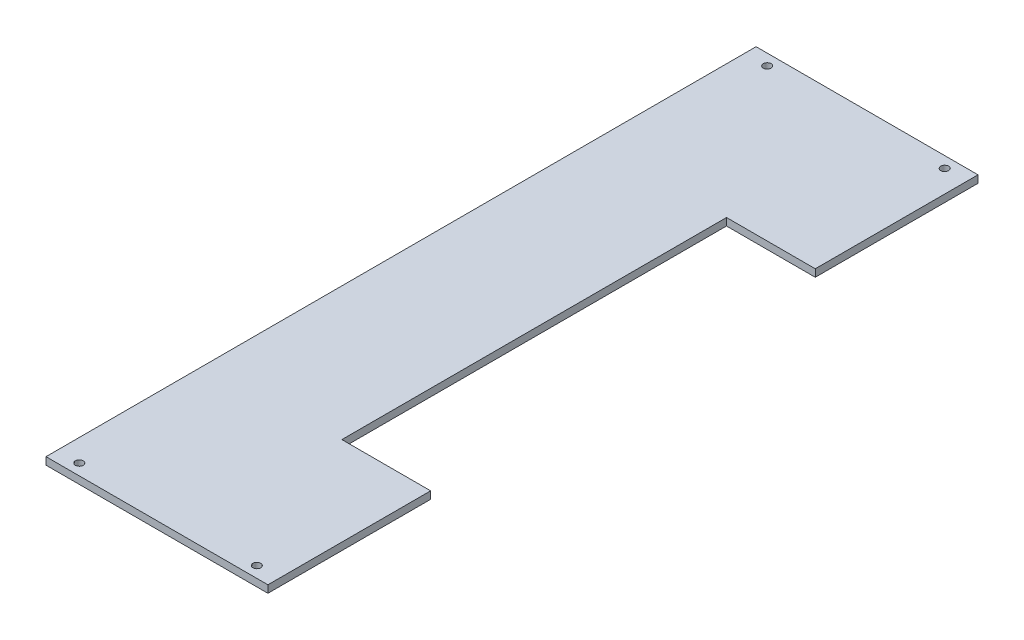
ISO-10303-21;
HEADER;
FILE_DESCRIPTION(('STEP AP214'),'2;1');
FILE_NAME('part.step','',(''),(''),'','','');
FILE_SCHEMA(('AUTOMOTIVE_DESIGN { 1 0 10303 214 1 1 1 1 }'));
ENDSEC;
DATA;
#1=APPLICATION_CONTEXT('core data for automotive mechanical design processes');
#2=APPLICATION_PROTOCOL_DEFINITION('international standard','automotive_design',2000,#1);
#3=PRODUCT_CONTEXT('',#1,'mechanical');
#4=PRODUCT('Part','Part','',(#3));
#5=PRODUCT_RELATED_PRODUCT_CATEGORY('part','',(#4));
#6=PRODUCT_DEFINITION_FORMATION('','',#4);
#7=PRODUCT_DEFINITION_CONTEXT('part definition',#1,'design');
#8=PRODUCT_DEFINITION('design','',#6,#7);
#9=PRODUCT_DEFINITION_SHAPE('','',#8);
#10=(LENGTH_UNIT() NAMED_UNIT(*) SI_UNIT(.MILLI.,.METRE.));
#11=(NAMED_UNIT(*) PLANE_ANGLE_UNIT() SI_UNIT($,.RADIAN.));
#12=(NAMED_UNIT(*) SI_UNIT($,.STERADIAN.) SOLID_ANGLE_UNIT());
#13=UNCERTAINTY_MEASURE_WITH_UNIT(LENGTH_MEASURE(1.E-05),#10,'distance_accuracy_value','');
#14=(GEOMETRIC_REPRESENTATION_CONTEXT(3) GLOBAL_UNCERTAINTY_ASSIGNED_CONTEXT((#13)) GLOBAL_UNIT_ASSIGNED_CONTEXT((#10,
#11,#12)) REPRESENTATION_CONTEXT('',''));
#15=CARTESIAN_POINT('',(0.,0.,0.));
#16=DIRECTION('',(0.,0.,1.));
#17=DIRECTION('',(1.,0.,0.));
#18=AXIS2_PLACEMENT_3D('',#15,#16,#17);
#19=CARTESIAN_POINT('',(0.,6.35,0.));
#20=DIRECTION('',(0.,1.,0.));
#21=DIRECTION('',(0.,0.,1.));
#22=AXIS2_PLACEMENT_3D('',#19,#20,#21);
#23=PLANE('',#22);
#24=CARTESIAN_POINT('',(76.2,6.35,-295.275));
#25=DIRECTION('',(0.,-1.,0.));
#26=DIRECTION('',(0.,0.,-1.));
#27=AXIS2_PLACEMENT_3D('',#24,#25,#26);
#28=CIRCLE('',#27,3.3655);
#29=CARTESIAN_POINT('',(76.2,6.35,-298.6405));
#30=VERTEX_POINT('',#29);
#31=EDGE_CURVE('E118',#30,#30,#28,.T.);
#32=ORIENTED_EDGE('',*,*,#31,.T.);
#33=EDGE_LOOP('',(#32));
#34=FACE_BOUND('',#33,.T.);
#35=CARTESIAN_POINT('',(-76.2,6.35,-295.275));
#36=DIRECTION('',(0.,-1.,0.));
#37=DIRECTION('',(0.,0.,-1.));
#38=AXIS2_PLACEMENT_3D('',#35,#36,#37);
#39=CIRCLE('',#38,3.3655);
#40=CARTESIAN_POINT('',(-76.2,6.35,-298.6405));
#41=VERTEX_POINT('',#40);
#42=EDGE_CURVE('E121',#41,#41,#39,.T.);
#43=ORIENTED_EDGE('',*,*,#42,.T.);
#44=EDGE_LOOP('',(#43));
#45=FACE_BOUND('',#44,.T.);
#46=CARTESIAN_POINT('',(76.2,6.35,295.275));
#47=DIRECTION('',(0.,1.,0.));
#48=DIRECTION('',(0.,0.,1.));
#49=AXIS2_PLACEMENT_3D('',#46,#47,#48);
#50=CIRCLE('',#49,3.3655);
#51=CARTESIAN_POINT('',(76.2,6.35,298.6405));
#52=VERTEX_POINT('',#51);
#53=EDGE_CURVE('E123',#52,#52,#50,.F.);
#54=ORIENTED_EDGE('',*,*,#53,.T.);
#55=EDGE_LOOP('',(#54));
#56=FACE_BOUND('',#55,.T.);
#57=CARTESIAN_POINT('',(-76.2,6.35,295.275));
#58=DIRECTION('',(0.,1.,0.));
#59=DIRECTION('',(0.,0.,1.));
#60=AXIS2_PLACEMENT_3D('',#57,#58,#59);
#61=CIRCLE('',#60,3.3655);
#62=CARTESIAN_POINT('',(-76.2,6.35,298.6405));
#63=VERTEX_POINT('',#62);
#64=EDGE_CURVE('E20',#63,#63,#61,.F.);
#65=ORIENTED_EDGE('',*,*,#64,.T.);
#66=EDGE_LOOP('',(#65));
#67=FACE_BOUND('',#66,.T.);
#68=DIRECTION('',(0.,0.,1.));
#69=VECTOR('',#68,1.);
#70=CARTESIAN_POINT('',(19.05,6.35,-165.1));
#71=LINE('',#70,#69);
#72=CARTESIAN_POINT('',(19.05,6.35,165.1));
#73=VERTEX_POINT('',#72);
#74=CARTESIAN_POINT('',(19.05,6.35,-165.1));
#75=VERTEX_POINT('',#74);
#76=EDGE_CURVE('E97',#73,#75,#71,.F.);
#77=ORIENTED_EDGE('',*,*,#76,.T.);
#78=DIRECTION('',(-1.,0.,0.));
#79=VECTOR('',#78,1.);
#80=CARTESIAN_POINT('',(95.25,6.35,-165.1));
#81=LINE('',#80,#79);
#82=CARTESIAN_POINT('',(95.25,6.35,-165.1));
#83=VERTEX_POINT('',#82);
#84=EDGE_CURVE('E94',#75,#83,#81,.F.);
#85=ORIENTED_EDGE('',*,*,#84,.T.);
#86=DIRECTION('',(0.,0.,-1.));
#87=VECTOR('',#86,1.);
#88=CARTESIAN_POINT('',(95.25,6.35,304.8));
#89=LINE('',#88,#87);
#90=CARTESIAN_POINT('',(95.25,6.35,-304.8));
#91=VERTEX_POINT('',#90);
#92=EDGE_CURVE('E85',#91,#83,#89,.F.);
#93=ORIENTED_EDGE('',*,*,#92,.F.);
#94=DIRECTION('',(-1.,0.,0.));
#95=VECTOR('',#94,1.);
#96=CARTESIAN_POINT('',(95.25,6.35,-304.8));
#97=LINE('',#96,#95);
#98=CARTESIAN_POINT('',(-95.25,6.35,-304.8));
#99=VERTEX_POINT('',#98);
#100=EDGE_CURVE('E80',#99,#91,#97,.F.);
#101=ORIENTED_EDGE('',*,*,#100,.F.);
#102=DIRECTION('',(0.,0.,1.));
#103=VECTOR('',#102,1.);
#104=CARTESIAN_POINT('',(-95.25,6.35,-304.8));
#105=LINE('',#104,#103);
#106=CARTESIAN_POINT('',(-95.25,6.35,304.8));
#107=VERTEX_POINT('',#106);
#108=EDGE_CURVE('E152',#107,#99,#105,.F.);
#109=ORIENTED_EDGE('',*,*,#108,.F.);
#110=DIRECTION('',(1.,0.,0.));
#111=VECTOR('',#110,1.);
#112=CARTESIAN_POINT('',(-95.25,6.35,304.8));
#113=LINE('',#112,#111);
#114=CARTESIAN_POINT('',(95.25,6.35,304.8));
#115=VERTEX_POINT('',#114);
#116=EDGE_CURVE('E148',#115,#107,#113,.F.);
#117=ORIENTED_EDGE('',*,*,#116,.F.);
#118=DIRECTION('',(0.,0.,-1.));
#119=VECTOR('',#118,1.);
#120=CARTESIAN_POINT('',(95.25,6.35,304.8));
#121=LINE('',#120,#119);
#122=CARTESIAN_POINT('',(95.25,6.35,165.1));
#123=VERTEX_POINT('',#122);
#124=EDGE_CURVE('E144',#123,#115,#121,.F.);
#125=ORIENTED_EDGE('',*,*,#124,.F.);
#126=DIRECTION('',(1.,0.,0.));
#127=VECTOR('',#126,1.);
#128=CARTESIAN_POINT('',(19.05,6.35,165.1));
#129=LINE('',#128,#127);
#130=EDGE_CURVE('E137',#123,#73,#129,.F.);
#131=ORIENTED_EDGE('',*,*,#130,.T.);
#132=EDGE_LOOP('',(#77,#85,#93,#101,#109,#117,#125,#131));
#133=FACE_BOUND('',#132,.T.);
#134=ADVANCED_FACE('F17',(#34,#45,#56,#67,#133),#23,.T.);
#135=CARTESIAN_POINT('',(95.25,6.35,-165.1));
#136=DIRECTION('',(0.,0.,-1.));
#137=DIRECTION('',(-1.,0.,0.));
#138=AXIS2_PLACEMENT_3D('',#135,#136,#137);
#139=PLANE('',#138);
#140=ORIENTED_EDGE('',*,*,#84,.F.);
#141=DIRECTION('',(0.,1.,0.));
#142=VECTOR('',#141,1.);
#143=CARTESIAN_POINT('',(19.05,6.35,-165.1));
#144=LINE('',#143,#142);
#145=CARTESIAN_POINT('',(19.05,0.,-165.1));
#146=VERTEX_POINT('',#145);
#147=EDGE_CURVE('E128',#75,#146,#144,.F.);
#148=ORIENTED_EDGE('',*,*,#147,.T.);
#149=DIRECTION('',(1.,0.,0.));
#150=VECTOR('',#149,1.);
#151=CARTESIAN_POINT('',(0.,0.,-165.1));
#152=LINE('',#151,#150);
#153=CARTESIAN_POINT('',(95.25,0.,-165.1));
#154=VERTEX_POINT('',#153);
#155=EDGE_CURVE('E104',#146,#154,#152,.T.);
#156=ORIENTED_EDGE('',*,*,#155,.T.);
#157=DIRECTION('',(0.,1.,0.));
#158=VECTOR('',#157,1.);
#159=CARTESIAN_POINT('',(95.25,0.,-165.1));
#160=LINE('',#159,#158);
#161=EDGE_CURVE('E90',#83,#154,#160,.F.);
#162=ORIENTED_EDGE('',*,*,#161,.F.);
#163=EDGE_LOOP('',(#140,#148,#156,#162));
#164=FACE_BOUND('',#163,.T.);
#165=ADVANCED_FACE('F103',(#164),#139,.F.);
#166=CARTESIAN_POINT('',(95.25,0.,304.8));
#167=DIRECTION('',(1.,0.,0.));
#168=DIRECTION('',(0.,0.,-1.));
#169=AXIS2_PLACEMENT_3D('',#166,#167,#168);
#170=PLANE('',#169);
#171=ORIENTED_EDGE('',*,*,#92,.T.);
#172=ORIENTED_EDGE('',*,*,#161,.T.);
#173=DIRECTION('',(0.,0.,1.));
#174=VECTOR('',#173,1.);
#175=CARTESIAN_POINT('',(95.25,0.,0.));
#176=LINE('',#175,#174);
#177=CARTESIAN_POINT('',(95.25,0.,-304.8));
#178=VERTEX_POINT('',#177);
#179=EDGE_CURVE('E161',#154,#178,#176,.F.);
#180=ORIENTED_EDGE('',*,*,#179,.T.);
#181=DIRECTION('',(0.,1.,0.));
#182=VECTOR('',#181,1.);
#183=CARTESIAN_POINT('',(95.25,0.,-304.8));
#184=LINE('',#183,#182);
#185=EDGE_CURVE('E92',#91,#178,#184,.F.);
#186=ORIENTED_EDGE('',*,*,#185,.F.);
#187=EDGE_LOOP('',(#171,#172,#180,#186));
#188=FACE_BOUND('',#187,.T.);
#189=ADVANCED_FACE('F87',(#188),#170,.T.);
#190=CARTESIAN_POINT('',(95.25,0.,-304.8));
#191=DIRECTION('',(0.,0.,-1.));
#192=DIRECTION('',(-1.,0.,0.));
#193=AXIS2_PLACEMENT_3D('',#190,#191,#192);
#194=PLANE('',#193);
#195=ORIENTED_EDGE('',*,*,#185,.T.);
#196=DIRECTION('',(1.,0.,0.));
#197=VECTOR('',#196,1.);
#198=CARTESIAN_POINT('',(0.,0.,-304.8));
#199=LINE('',#198,#197);
#200=CARTESIAN_POINT('',(-95.25,0.,-304.8));
#201=VERTEX_POINT('',#200);
#202=EDGE_CURVE('E156',#178,#201,#199,.F.);
#203=ORIENTED_EDGE('',*,*,#202,.T.);
#204=DIRECTION('',(0.,1.,0.));
#205=VECTOR('',#204,1.);
#206=CARTESIAN_POINT('',(-95.25,0.,-304.8));
#207=LINE('',#206,#205);
#208=EDGE_CURVE('E150',#99,#201,#207,.F.);
#209=ORIENTED_EDGE('',*,*,#208,.F.);
#210=ORIENTED_EDGE('',*,*,#100,.T.);
#211=EDGE_LOOP('',(#195,#203,#209,#210));
#212=FACE_BOUND('',#211,.T.);
#213=ADVANCED_FACE('F155',(#212),#194,.T.);
#214=CARTESIAN_POINT('',(-95.25,0.,-304.8));
#215=DIRECTION('',(-1.,0.,0.));
#216=DIRECTION('',(0.,0.,1.));
#217=AXIS2_PLACEMENT_3D('',#214,#215,#216);
#218=PLANE('',#217);
#219=ORIENTED_EDGE('',*,*,#208,.T.);
#220=DIRECTION('',(0.,0.,1.));
#221=VECTOR('',#220,1.);
#222=CARTESIAN_POINT('',(-95.25,0.,0.));
#223=LINE('',#222,#221);
#224=CARTESIAN_POINT('',(-95.25,0.,304.8));
#225=VERTEX_POINT('',#224);
#226=EDGE_CURVE('E164',#201,#225,#223,.T.);
#227=ORIENTED_EDGE('',*,*,#226,.T.);
#228=DIRECTION('',(0.,1.,0.));
#229=VECTOR('',#228,1.);
#230=CARTESIAN_POINT('',(-95.25,0.,304.8));
#231=LINE('',#230,#229);
#232=EDGE_CURVE('E146',#107,#225,#231,.F.);
#233=ORIENTED_EDGE('',*,*,#232,.F.);
#234=ORIENTED_EDGE('',*,*,#108,.T.);
#235=EDGE_LOOP('',(#219,#227,#233,#234));
#236=FACE_BOUND('',#235,.T.);
#237=ADVANCED_FACE('F191',(#236),#218,.T.);
#238=CARTESIAN_POINT('',(-95.25,0.,304.8));
#239=DIRECTION('',(0.,0.,1.));
#240=DIRECTION('',(1.,0.,0.));
#241=AXIS2_PLACEMENT_3D('',#238,#239,#240);
#242=PLANE('',#241);
#243=ORIENTED_EDGE('',*,*,#232,.T.);
#244=DIRECTION('',(1.,0.,0.));
#245=VECTOR('',#244,1.);
#246=CARTESIAN_POINT('',(0.,0.,304.8));
#247=LINE('',#246,#245);
#248=CARTESIAN_POINT('',(95.25,0.,304.8));
#249=VERTEX_POINT('',#248);
#250=EDGE_CURVE('E168',#225,#249,#247,.T.);
#251=ORIENTED_EDGE('',*,*,#250,.T.);
#252=DIRECTION('',(0.,1.,0.));
#253=VECTOR('',#252,1.);
#254=CARTESIAN_POINT('',(95.25,0.,304.8));
#255=LINE('',#254,#253);
#256=EDGE_CURVE('E142',#115,#249,#255,.F.);
#257=ORIENTED_EDGE('',*,*,#256,.F.);
#258=ORIENTED_EDGE('',*,*,#116,.T.);
#259=EDGE_LOOP('',(#243,#251,#257,#258));
#260=FACE_BOUND('',#259,.T.);
#261=ADVANCED_FACE('F187',(#260),#242,.T.);
#262=CARTESIAN_POINT('',(95.25,0.,304.8));
#263=DIRECTION('',(1.,0.,0.));
#264=DIRECTION('',(0.,0.,-1.));
#265=AXIS2_PLACEMENT_3D('',#262,#263,#264);
#266=PLANE('',#265);
#267=DIRECTION('',(0.,0.,1.));
#268=VECTOR('',#267,1.);
#269=CARTESIAN_POINT('',(95.25,0.,0.));
#270=LINE('',#269,#268);
#271=CARTESIAN_POINT('',(95.25,0.,165.1));
#272=VERTEX_POINT('',#271);
#273=EDGE_CURVE('E171',#249,#272,#270,.F.);
#274=ORIENTED_EDGE('',*,*,#273,.T.);
#275=DIRECTION('',(0.,1.,0.));
#276=VECTOR('',#275,1.);
#277=CARTESIAN_POINT('',(95.25,6.35,165.1));
#278=LINE('',#277,#276);
#279=EDGE_CURVE('E139',#272,#123,#278,.T.);
#280=ORIENTED_EDGE('',*,*,#279,.T.);
#281=ORIENTED_EDGE('',*,*,#124,.T.);
#282=ORIENTED_EDGE('',*,*,#256,.T.);
#283=EDGE_LOOP('',(#274,#280,#281,#282));
#284=FACE_BOUND('',#283,.T.);
#285=ADVANCED_FACE('F183',(#284),#266,.T.);
#286=CARTESIAN_POINT('',(19.05,6.35,165.1));
#287=DIRECTION('',(0.,0.,1.));
#288=DIRECTION('',(1.,0.,0.));
#289=AXIS2_PLACEMENT_3D('',#286,#287,#288);
#290=PLANE('',#289);
#291=ORIENTED_EDGE('',*,*,#130,.F.);
#292=ORIENTED_EDGE('',*,*,#279,.F.);
#293=DIRECTION('',(1.,0.,0.));
#294=VECTOR('',#293,1.);
#295=CARTESIAN_POINT('',(0.,0.,165.1));
#296=LINE('',#295,#294);
#297=CARTESIAN_POINT('',(19.05,0.,165.1));
#298=VERTEX_POINT('',#297);
#299=EDGE_CURVE('E174',#272,#298,#296,.F.);
#300=ORIENTED_EDGE('',*,*,#299,.T.);
#301=DIRECTION('',(0.,1.,0.));
#302=VECTOR('',#301,1.);
#303=CARTESIAN_POINT('',(19.05,6.35,165.1));
#304=LINE('',#303,#302);
#305=EDGE_CURVE('E35',#298,#73,#304,.T.);
#306=ORIENTED_EDGE('',*,*,#305,.T.);
#307=EDGE_LOOP('',(#291,#292,#300,#306));
#308=FACE_BOUND('',#307,.T.);
#309=ADVANCED_FACE('F181',(#308),#290,.F.);
#310=CARTESIAN_POINT('',(19.05,6.35,-165.1));
#311=DIRECTION('',(-1.,0.,0.));
#312=DIRECTION('',(0.,0.,1.));
#313=AXIS2_PLACEMENT_3D('',#310,#311,#312);
#314=PLANE('',#313);
#315=ORIENTED_EDGE('',*,*,#76,.F.);
#316=ORIENTED_EDGE('',*,*,#305,.F.);
#317=DIRECTION('',(0.,0.,1.));
#318=VECTOR('',#317,1.);
#319=CARTESIAN_POINT('',(19.05,0.,0.));
#320=LINE('',#319,#318);
#321=EDGE_CURVE('E117',#298,#146,#320,.F.);
#322=ORIENTED_EDGE('',*,*,#321,.T.);
#323=ORIENTED_EDGE('',*,*,#147,.F.);
#324=EDGE_LOOP('',(#315,#316,#322,#323));
#325=FACE_BOUND('',#324,.T.);
#326=ADVANCED_FACE('F177',(#325),#314,.F.);
#327=CARTESIAN_POINT('',(-76.2,6.35,295.275));
#328=DIRECTION('',(0.,1.,0.));
#329=DIRECTION('',(0.,0.,1.));
#330=AXIS2_PLACEMENT_3D('',#327,#328,#329);
#331=CYLINDRICAL_SURFACE('',#330,3.3655);
#332=ORIENTED_EDGE('',*,*,#64,.F.);
#333=EDGE_LOOP('',(#332));
#334=FACE_BOUND('',#333,.T.);
#335=CARTESIAN_POINT('',(-76.2,0.,295.275));
#336=DIRECTION('',(0.,1.,0.));
#337=DIRECTION('',(0.,0.,1.));
#338=AXIS2_PLACEMENT_3D('',#335,#336,#337);
#339=CIRCLE('',#338,3.3655);
#340=CARTESIAN_POINT('',(-76.2,0.,298.6405));
#341=VERTEX_POINT('',#340);
#342=EDGE_CURVE('E114',#341,#341,#339,.F.);
#343=ORIENTED_EDGE('',*,*,#342,.T.);
#344=EDGE_LOOP('',(#343));
#345=FACE_BOUND('',#344,.T.);
#346=ADVANCED_FACE('F220',(#334,#345),#331,.F.);
#347=CARTESIAN_POINT('',(76.2,6.35,295.275));
#348=DIRECTION('',(0.,1.,0.));
#349=DIRECTION('',(0.,0.,1.));
#350=AXIS2_PLACEMENT_3D('',#347,#348,#349);
#351=CYLINDRICAL_SURFACE('',#350,3.3655);
#352=ORIENTED_EDGE('',*,*,#53,.F.);
#353=EDGE_LOOP('',(#352));
#354=FACE_BOUND('',#353,.T.);
#355=CARTESIAN_POINT('',(76.2,0.,295.275));
#356=DIRECTION('',(0.,1.,0.));
#357=DIRECTION('',(0.,0.,1.));
#358=AXIS2_PLACEMENT_3D('',#355,#356,#357);
#359=CIRCLE('',#358,3.3655);
#360=CARTESIAN_POINT('',(76.2,0.,298.6405));
#361=VERTEX_POINT('',#360);
#362=EDGE_CURVE('E111',#361,#361,#359,.F.);
#363=ORIENTED_EDGE('',*,*,#362,.T.);
#364=EDGE_LOOP('',(#363));
#365=FACE_BOUND('',#364,.T.);
#366=ADVANCED_FACE('F216',(#354,#365),#351,.F.);
#367=CARTESIAN_POINT('',(-76.2,6.35,-295.275));
#368=DIRECTION('',(0.,-1.,0.));
#369=DIRECTION('',(0.,0.,-1.));
#370=AXIS2_PLACEMENT_3D('',#367,#368,#369);
#371=CYLINDRICAL_SURFACE('',#370,3.3655);
#372=CARTESIAN_POINT('',(-76.2,0.,-295.275));
#373=DIRECTION('',(0.,-1.,0.));
#374=DIRECTION('',(0.,0.,-1.));
#375=AXIS2_PLACEMENT_3D('',#372,#373,#374);
#376=CIRCLE('',#375,3.3655);
#377=CARTESIAN_POINT('',(-76.2,0.,-298.6405));
#378=VERTEX_POINT('',#377);
#379=EDGE_CURVE('E26',#378,#378,#376,.T.);
#380=ORIENTED_EDGE('',*,*,#379,.T.);
#381=EDGE_LOOP('',(#380));
#382=FACE_BOUND('',#381,.T.);
#383=ORIENTED_EDGE('',*,*,#42,.F.);
#384=EDGE_LOOP('',(#383));
#385=FACE_BOUND('',#384,.T.);
#386=ADVANCED_FACE('F208',(#382,#385),#371,.F.);
#387=CARTESIAN_POINT('',(76.2,6.35,-295.275));
#388=DIRECTION('',(0.,-1.,0.));
#389=DIRECTION('',(0.,0.,-1.));
#390=AXIS2_PLACEMENT_3D('',#387,#388,#389);
#391=CYLINDRICAL_SURFACE('',#390,3.3655);
#392=CARTESIAN_POINT('',(76.2,0.,-295.275));
#393=DIRECTION('',(0.,-1.,0.));
#394=DIRECTION('',(0.,0.,-1.));
#395=AXIS2_PLACEMENT_3D('',#392,#393,#394);
#396=CIRCLE('',#395,3.3655);
#397=CARTESIAN_POINT('',(76.2,0.,-298.6405));
#398=VERTEX_POINT('',#397);
#399=EDGE_CURVE('E11',#398,#398,#396,.T.);
#400=ORIENTED_EDGE('',*,*,#399,.T.);
#401=EDGE_LOOP('',(#400));
#402=FACE_BOUND('',#401,.T.);
#403=ORIENTED_EDGE('',*,*,#31,.F.);
#404=EDGE_LOOP('',(#403));
#405=FACE_BOUND('',#404,.T.);
#406=ADVANCED_FACE('F202',(#402,#405),#391,.F.);
#407=CARTESIAN_POINT('',(0.,0.,0.));
#408=DIRECTION('',(0.,1.,0.));
#409=DIRECTION('',(0.,0.,1.));
#410=AXIS2_PLACEMENT_3D('',#407,#408,#409);
#411=PLANE('',#410);
#412=ORIENTED_EDGE('',*,*,#399,.F.);
#413=EDGE_LOOP('',(#412));
#414=FACE_BOUND('',#413,.T.);
#415=ORIENTED_EDGE('',*,*,#379,.F.);
#416=EDGE_LOOP('',(#415));
#417=FACE_BOUND('',#416,.T.);
#418=ORIENTED_EDGE('',*,*,#362,.F.);
#419=EDGE_LOOP('',(#418));
#420=FACE_BOUND('',#419,.T.);
#421=ORIENTED_EDGE('',*,*,#342,.F.);
#422=EDGE_LOOP('',(#421));
#423=FACE_BOUND('',#422,.T.);
#424=ORIENTED_EDGE('',*,*,#299,.F.);
#425=ORIENTED_EDGE('',*,*,#273,.F.);
#426=ORIENTED_EDGE('',*,*,#250,.F.);
#427=ORIENTED_EDGE('',*,*,#226,.F.);
#428=ORIENTED_EDGE('',*,*,#202,.F.);
#429=ORIENTED_EDGE('',*,*,#179,.F.);
#430=ORIENTED_EDGE('',*,*,#155,.F.);
#431=ORIENTED_EDGE('',*,*,#321,.F.);
#432=EDGE_LOOP('',(#424,#425,#426,#427,#428,#429,#430,#431));
#433=FACE_BOUND('',#432,.T.);
#434=ADVANCED_FACE('F160',(#414,#417,#420,#423,#433),#411,.F.);
#435=CLOSED_SHELL('',(#134,#165,#189,#213,#237,#261,#285,#309,#326,#346,#366,#386,#406,#434));
#436=MANIFOLD_SOLID_BREP('B1',#435);
#437=ADVANCED_BREP_SHAPE_REPRESENTATION('',(#18,#436),#14);
#438=SHAPE_DEFINITION_REPRESENTATION(#9,#437);
ENDSEC;
END-ISO-10303-21;
